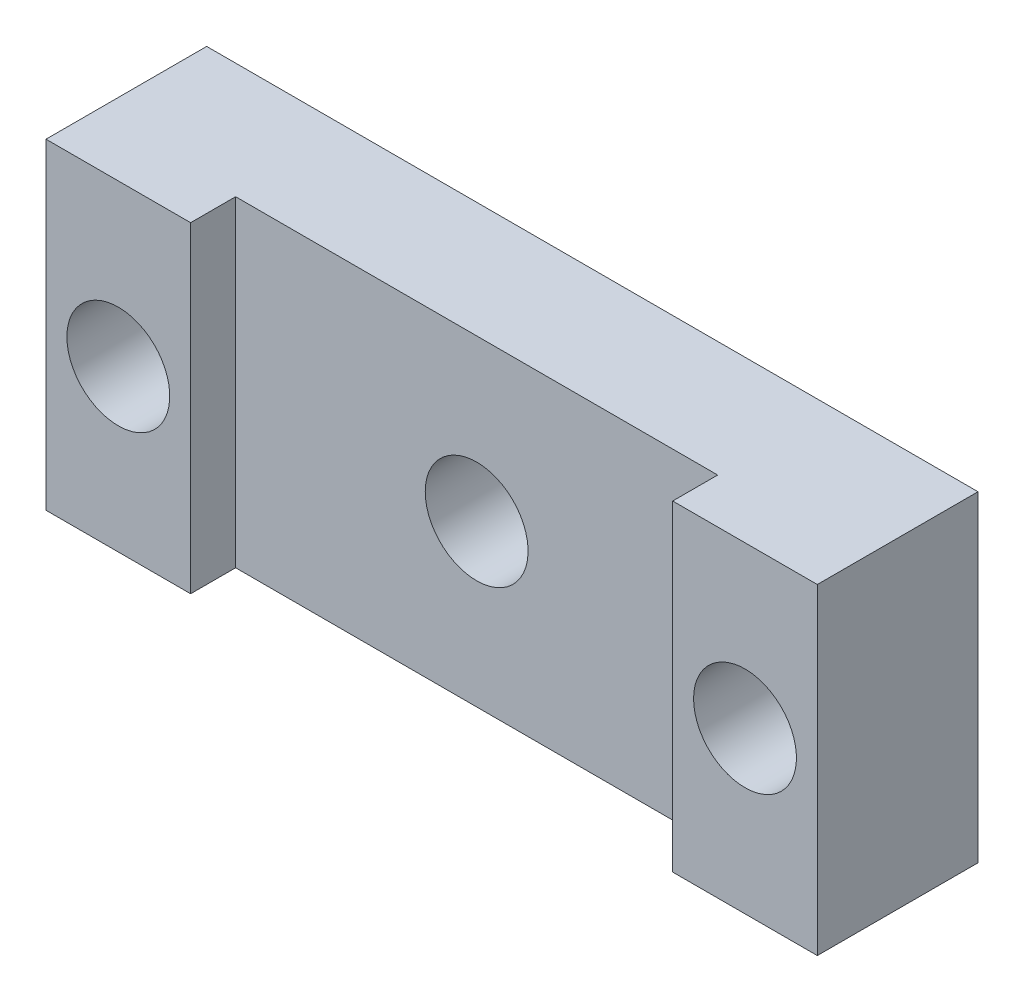
ISO-10303-21;
HEADER;
FILE_DESCRIPTION(('STEP AP214'),'2;1');
FILE_NAME('part.step','',(''),(''),'','','');
FILE_SCHEMA(('AUTOMOTIVE_DESIGN { 1 0 10303 214 1 1 1 1 }'));
ENDSEC;
DATA;
#1=APPLICATION_CONTEXT('core data for automotive mechanical design processes');
#2=APPLICATION_PROTOCOL_DEFINITION('international standard','automotive_design',2000,#1);
#3=PRODUCT_CONTEXT('',#1,'mechanical');
#4=PRODUCT('Part','Part','',(#3));
#5=PRODUCT_RELATED_PRODUCT_CATEGORY('part','',(#4));
#6=PRODUCT_DEFINITION_FORMATION('','',#4);
#7=PRODUCT_DEFINITION_CONTEXT('part definition',#1,'design');
#8=PRODUCT_DEFINITION('design','',#6,#7);
#9=PRODUCT_DEFINITION_SHAPE('','',#8);
#10=(LENGTH_UNIT() NAMED_UNIT(*) SI_UNIT(.MILLI.,.METRE.));
#11=(NAMED_UNIT(*) PLANE_ANGLE_UNIT() SI_UNIT($,.RADIAN.));
#12=(NAMED_UNIT(*) SI_UNIT($,.STERADIAN.) SOLID_ANGLE_UNIT());
#13=UNCERTAINTY_MEASURE_WITH_UNIT(LENGTH_MEASURE(1.E-05),#10,'distance_accuracy_value','');
#14=(GEOMETRIC_REPRESENTATION_CONTEXT(3) GLOBAL_UNCERTAINTY_ASSIGNED_CONTEXT((#13)) GLOBAL_UNIT_ASSIGNED_CONTEXT((#10,
#11,#12)) REPRESENTATION_CONTEXT('',''));
#15=CARTESIAN_POINT('',(0.,0.,0.));
#16=DIRECTION('',(0.,0.,1.));
#17=DIRECTION('',(1.,0.,0.));
#18=AXIS2_PLACEMENT_3D('',#15,#16,#17);
#19=CARTESIAN_POINT('',(0.,5.,0.));
#20=DIRECTION('',(1.,0.,0.));
#21=DIRECTION('',(0.,0.,-1.));
#22=AXIS2_PLACEMENT_3D('',#19,#20,#21);
#23=PLANE('',#22);
#24=DIRECTION('',(0.,0.,1.));
#25=VECTOR('',#24,1.);
#26=CARTESIAN_POINT('',(0.,0.,0.));
#27=LINE('',#26,#25);
#28=CARTESIAN_POINT('',(0.,0.,-2.5));
#29=VERTEX_POINT('',#28);
#30=CARTESIAN_POINT('',(0.,0.,0.));
#31=VERTEX_POINT('',#30);
#32=EDGE_CURVE('E128',#29,#31,#27,.T.);
#33=ORIENTED_EDGE('',*,*,#32,.T.);
#34=DIRECTION('',(0.,-1.,0.));
#35=VECTOR('',#34,1.);
#36=CARTESIAN_POINT('',(0.,5.,0.));
#37=LINE('',#36,#35);
#38=CARTESIAN_POINT('',(0.,5.,0.));
#39=VERTEX_POINT('',#38);
#40=EDGE_CURVE('E11',#39,#31,#37,.T.);
#41=ORIENTED_EDGE('',*,*,#40,.F.);
#42=DIRECTION('',(0.,0.,1.));
#43=VECTOR('',#42,1.);
#44=CARTESIAN_POINT('',(0.,5.,0.));
#45=LINE('',#44,#43);
#46=CARTESIAN_POINT('',(0.,5.,-2.5));
#47=VERTEX_POINT('',#46);
#48=EDGE_CURVE('E143',#47,#39,#45,.T.);
#49=ORIENTED_EDGE('',*,*,#48,.F.);
#50=DIRECTION('',(0.,-1.,0.));
#51=VECTOR('',#50,1.);
#52=CARTESIAN_POINT('',(0.,5.,-2.5));
#53=LINE('',#52,#51);
#54=EDGE_CURVE('E124',#47,#29,#53,.T.);
#55=ORIENTED_EDGE('',*,*,#54,.T.);
#56=EDGE_LOOP('',(#33,#41,#49,#55));
#57=FACE_BOUND('',#56,.T.);
#58=ADVANCED_FACE('F32',(#57),#23,.F.);
#59=CARTESIAN_POINT('',(0.,5.,0.));
#60=DIRECTION('',(0.,0.,-1.));
#61=DIRECTION('',(-1.,0.,0.));
#62=AXIS2_PLACEMENT_3D('',#59,#60,#61);
#63=PLANE('',#62);
#64=CARTESIAN_POINT('',(1.125,2.5,0.));
#65=DIRECTION('',(0.,0.,-1.));
#66=DIRECTION('',(-1.,0.,0.));
#67=AXIS2_PLACEMENT_3D('',#64,#65,#66);
#68=CIRCLE('',#67,0.800000050999994);
#69=CARTESIAN_POINT('',(0.324999949000006,2.5,0.));
#70=VERTEX_POINT('',#69);
#71=EDGE_CURVE('E187',#70,#70,#68,.T.);
#72=ORIENTED_EDGE('',*,*,#71,.T.);
#73=EDGE_LOOP('',(#72));
#74=FACE_BOUND('',#73,.T.);
#75=DIRECTION('',(1.,0.,0.));
#76=VECTOR('',#75,1.);
#77=CARTESIAN_POINT('',(0.,0.,0.));
#78=LINE('',#77,#76);
#79=CARTESIAN_POINT('',(2.25,0.,0.));
#80=VERTEX_POINT('',#79);
#81=EDGE_CURVE('E131',#31,#80,#78,.T.);
#82=ORIENTED_EDGE('',*,*,#81,.T.);
#83=DIRECTION('',(0.,-1.,0.));
#84=VECTOR('',#83,1.);
#85=CARTESIAN_POINT('',(2.25,5.,0.));
#86=LINE('',#85,#84);
#87=CARTESIAN_POINT('',(2.25,5.,0.));
#88=VERTEX_POINT('',#87);
#89=EDGE_CURVE('E40',#88,#80,#86,.T.);
#90=ORIENTED_EDGE('',*,*,#89,.F.);
#91=DIRECTION('',(1.,0.,0.));
#92=VECTOR('',#91,1.);
#93=CARTESIAN_POINT('',(0.,5.,0.));
#94=LINE('',#93,#92);
#95=EDGE_CURVE('E91',#39,#88,#94,.T.);
#96=ORIENTED_EDGE('',*,*,#95,.F.);
#97=ORIENTED_EDGE('',*,*,#40,.T.);
#98=EDGE_LOOP('',(#82,#90,#96,#97));
#99=FACE_BOUND('',#98,.T.);
#100=ADVANCED_FACE('F223',(#74,#99),#63,.F.);
#101=CARTESIAN_POINT('',(2.25,5.,0.));
#102=DIRECTION('',(-1.,0.,0.));
#103=DIRECTION('',(0.,0.,1.));
#104=AXIS2_PLACEMENT_3D('',#101,#102,#103);
#105=PLANE('',#104);
#106=DIRECTION('',(0.,0.,-1.));
#107=VECTOR('',#106,1.);
#108=CARTESIAN_POINT('',(2.25,0.,0.));
#109=LINE('',#108,#107);
#110=CARTESIAN_POINT('',(2.25,0.,-0.7));
#111=VERTEX_POINT('',#110);
#112=EDGE_CURVE('E134',#80,#111,#109,.T.);
#113=ORIENTED_EDGE('',*,*,#112,.T.);
#114=DIRECTION('',(0.,-1.,0.));
#115=VECTOR('',#114,1.);
#116=CARTESIAN_POINT('',(2.25,5.,-0.7));
#117=LINE('',#116,#115);
#118=CARTESIAN_POINT('',(2.25,5.,-0.7));
#119=VERTEX_POINT('',#118);
#120=EDGE_CURVE('E150',#119,#111,#117,.T.);
#121=ORIENTED_EDGE('',*,*,#120,.F.);
#122=DIRECTION('',(0.,0.,-1.));
#123=VECTOR('',#122,1.);
#124=CARTESIAN_POINT('',(2.25,5.,0.));
#125=LINE('',#124,#123);
#126=EDGE_CURVE('E158',#88,#119,#125,.T.);
#127=ORIENTED_EDGE('',*,*,#126,.F.);
#128=ORIENTED_EDGE('',*,*,#89,.T.);
#129=EDGE_LOOP('',(#113,#121,#127,#128));
#130=FACE_BOUND('',#129,.T.);
#131=ADVANCED_FACE('F156',(#130),#105,.F.);
#132=CARTESIAN_POINT('',(2.25,5.,-0.7));
#133=DIRECTION('',(0.,0.,-1.));
#134=DIRECTION('',(-1.,0.,0.));
#135=AXIS2_PLACEMENT_3D('',#132,#133,#134);
#136=PLANE('',#135);
#137=CARTESIAN_POINT('',(6.,2.5,-0.7));
#138=DIRECTION('',(0.,0.,-1.));
#139=DIRECTION('',(-1.,0.,0.));
#140=AXIS2_PLACEMENT_3D('',#137,#138,#139);
#141=CIRCLE('',#140,0.799999999999989);
#142=CARTESIAN_POINT('',(5.20000000000001,2.5,-0.7));
#143=VERTEX_POINT('',#142);
#144=EDGE_CURVE('E181',#143,#143,#141,.T.);
#145=ORIENTED_EDGE('',*,*,#144,.T.);
#146=EDGE_LOOP('',(#145));
#147=FACE_BOUND('',#146,.T.);
#148=DIRECTION('',(1.,0.,0.));
#149=VECTOR('',#148,1.);
#150=CARTESIAN_POINT('',(2.25,0.,-0.7));
#151=LINE('',#150,#149);
#152=CARTESIAN_POINT('',(9.75,0.,-0.7));
#153=VERTEX_POINT('',#152);
#154=EDGE_CURVE('E136',#111,#153,#151,.T.);
#155=ORIENTED_EDGE('',*,*,#154,.T.);
#156=DIRECTION('',(0.,-1.,0.));
#157=VECTOR('',#156,1.);
#158=CARTESIAN_POINT('',(9.75,5.,-0.7));
#159=LINE('',#158,#157);
#160=CARTESIAN_POINT('',(9.75,5.,-0.7));
#161=VERTEX_POINT('',#160);
#162=EDGE_CURVE('E147',#161,#153,#159,.T.);
#163=ORIENTED_EDGE('',*,*,#162,.F.);
#164=DIRECTION('',(1.,0.,0.));
#165=VECTOR('',#164,1.);
#166=CARTESIAN_POINT('',(2.25,5.,-0.7));
#167=LINE('',#166,#165);
#168=EDGE_CURVE('E170',#119,#161,#167,.T.);
#169=ORIENTED_EDGE('',*,*,#168,.F.);
#170=ORIENTED_EDGE('',*,*,#120,.T.);
#171=EDGE_LOOP('',(#155,#163,#169,#170));
#172=FACE_BOUND('',#171,.T.);
#173=ADVANCED_FACE('F166',(#147,#172),#136,.F.);
#174=CARTESIAN_POINT('',(9.75,5.,-0.7));
#175=DIRECTION('',(1.,0.,0.));
#176=DIRECTION('',(0.,0.,-1.));
#177=AXIS2_PLACEMENT_3D('',#174,#175,#176);
#178=PLANE('',#177);
#179=DIRECTION('',(0.,0.,1.));
#180=VECTOR('',#179,1.);
#181=CARTESIAN_POINT('',(9.75,0.,-0.7));
#182=LINE('',#181,#180);
#183=CARTESIAN_POINT('',(9.75,0.,0.));
#184=VERTEX_POINT('',#183);
#185=EDGE_CURVE('E138',#153,#184,#182,.T.);
#186=ORIENTED_EDGE('',*,*,#185,.T.);
#187=DIRECTION('',(0.,-1.,0.));
#188=VECTOR('',#187,1.);
#189=CARTESIAN_POINT('',(9.75,5.,0.));
#190=LINE('',#189,#188);
#191=CARTESIAN_POINT('',(9.75,5.,0.));
#192=VERTEX_POINT('',#191);
#193=EDGE_CURVE('E119',#192,#184,#190,.T.);
#194=ORIENTED_EDGE('',*,*,#193,.F.);
#195=DIRECTION('',(0.,0.,1.));
#196=VECTOR('',#195,1.);
#197=CARTESIAN_POINT('',(9.75,5.,-0.7));
#198=LINE('',#197,#196);
#199=EDGE_CURVE('E110',#161,#192,#198,.T.);
#200=ORIENTED_EDGE('',*,*,#199,.F.);
#201=ORIENTED_EDGE('',*,*,#162,.T.);
#202=EDGE_LOOP('',(#186,#194,#200,#201));
#203=FACE_BOUND('',#202,.T.);
#204=ADVANCED_FACE('F169',(#203),#178,.F.);
#205=CARTESIAN_POINT('',(9.75,5.,0.));
#206=DIRECTION('',(0.,0.,-1.));
#207=DIRECTION('',(-1.,0.,0.));
#208=AXIS2_PLACEMENT_3D('',#205,#206,#207);
#209=PLANE('',#208);
#210=CARTESIAN_POINT('',(10.875,2.5,0.));
#211=DIRECTION('',(0.,0.,-1.));
#212=DIRECTION('',(-1.,0.,0.));
#213=AXIS2_PLACEMENT_3D('',#210,#211,#212);
#214=CIRCLE('',#213,0.800000050999994);
#215=CARTESIAN_POINT('',(10.074999949,2.5,0.));
#216=VERTEX_POINT('',#215);
#217=EDGE_CURVE('E132',#216,#216,#214,.T.);
#218=ORIENTED_EDGE('',*,*,#217,.T.);
#219=EDGE_LOOP('',(#218));
#220=FACE_BOUND('',#219,.T.);
#221=DIRECTION('',(1.,0.,0.));
#222=VECTOR('',#221,1.);
#223=CARTESIAN_POINT('',(9.75,0.,0.));
#224=LINE('',#223,#222);
#225=CARTESIAN_POINT('',(12.,0.,0.));
#226=VERTEX_POINT('',#225);
#227=EDGE_CURVE('E118',#184,#226,#224,.T.);
#228=ORIENTED_EDGE('',*,*,#227,.T.);
#229=DIRECTION('',(0.,-1.,0.));
#230=VECTOR('',#229,1.);
#231=CARTESIAN_POINT('',(12.,5.,0.));
#232=LINE('',#231,#230);
#233=CARTESIAN_POINT('',(12.,5.,0.));
#234=VERTEX_POINT('',#233);
#235=EDGE_CURVE('E115',#234,#226,#232,.T.);
#236=ORIENTED_EDGE('',*,*,#235,.F.);
#237=DIRECTION('',(1.,0.,0.));
#238=VECTOR('',#237,1.);
#239=CARTESIAN_POINT('',(9.75,5.,0.));
#240=LINE('',#239,#238);
#241=EDGE_CURVE('E104',#192,#234,#240,.T.);
#242=ORIENTED_EDGE('',*,*,#241,.F.);
#243=ORIENTED_EDGE('',*,*,#193,.T.);
#244=EDGE_LOOP('',(#228,#236,#242,#243));
#245=FACE_BOUND('',#244,.T.);
#246=ADVANCED_FACE('F116',(#220,#245),#209,.F.);
#247=CARTESIAN_POINT('',(12.,5.,0.));
#248=DIRECTION('',(-1.,0.,0.));
#249=DIRECTION('',(0.,0.,1.));
#250=AXIS2_PLACEMENT_3D('',#247,#248,#249);
#251=PLANE('',#250);
#252=DIRECTION('',(0.,0.,-1.));
#253=VECTOR('',#252,1.);
#254=CARTESIAN_POINT('',(12.,0.,0.));
#255=LINE('',#254,#253);
#256=CARTESIAN_POINT('',(12.,0.,-2.5));
#257=VERTEX_POINT('',#256);
#258=EDGE_CURVE('E77',#226,#257,#255,.T.);
#259=ORIENTED_EDGE('',*,*,#258,.T.);
#260=DIRECTION('',(0.,-1.,0.));
#261=VECTOR('',#260,1.);
#262=CARTESIAN_POINT('',(12.,5.,-2.5));
#263=LINE('',#262,#261);
#264=CARTESIAN_POINT('',(12.,5.,-2.5));
#265=VERTEX_POINT('',#264);
#266=EDGE_CURVE('E120',#265,#257,#263,.T.);
#267=ORIENTED_EDGE('',*,*,#266,.F.);
#268=DIRECTION('',(0.,0.,-1.));
#269=VECTOR('',#268,1.);
#270=CARTESIAN_POINT('',(12.,5.,0.));
#271=LINE('',#270,#269);
#272=EDGE_CURVE('E108',#234,#265,#271,.T.);
#273=ORIENTED_EDGE('',*,*,#272,.F.);
#274=ORIENTED_EDGE('',*,*,#235,.T.);
#275=EDGE_LOOP('',(#259,#267,#273,#274));
#276=FACE_BOUND('',#275,.T.);
#277=ADVANCED_FACE('F122',(#276),#251,.F.);
#278=CARTESIAN_POINT('',(0.,5.,-2.5));
#279=DIRECTION('',(0.,0.,1.));
#280=DIRECTION('',(1.,0.,0.));
#281=AXIS2_PLACEMENT_3D('',#278,#279,#280);
#282=PLANE('',#281);
#283=CARTESIAN_POINT('',(1.125,2.5,-2.49999999999999));
#284=DIRECTION('',(0.,0.,-1.));
#285=DIRECTION('',(-1.,0.,0.));
#286=AXIS2_PLACEMENT_3D('',#283,#284,#285);
#287=CIRCLE('',#286,0.800000050999989);
#288=CARTESIAN_POINT('',(0.32499994900001,2.5,-2.49999999999999));
#289=VERTEX_POINT('',#288);
#290=EDGE_CURVE('E190',#289,#289,#287,.T.);
#291=ORIENTED_EDGE('',*,*,#290,.F.);
#292=EDGE_LOOP('',(#291));
#293=FACE_BOUND('',#292,.T.);
#294=CARTESIAN_POINT('',(6.,2.5,-2.5));
#295=DIRECTION('',(0.,0.,-1.));
#296=DIRECTION('',(-1.,0.,0.));
#297=AXIS2_PLACEMENT_3D('',#294,#295,#296);
#298=CIRCLE('',#297,0.79999999999999);
#299=CARTESIAN_POINT('',(5.20000000000001,2.5,-2.5));
#300=VERTEX_POINT('',#299);
#301=EDGE_CURVE('E184',#300,#300,#298,.T.);
#302=ORIENTED_EDGE('',*,*,#301,.F.);
#303=EDGE_LOOP('',(#302));
#304=FACE_BOUND('',#303,.T.);
#305=CARTESIAN_POINT('',(10.875,2.5,-2.5));
#306=DIRECTION('',(0.,0.,-1.));
#307=DIRECTION('',(-1.,0.,0.));
#308=AXIS2_PLACEMENT_3D('',#305,#306,#307);
#309=CIRCLE('',#308,0.800000050999989);
#310=CARTESIAN_POINT('',(10.074999949,2.5,-2.5));
#311=VERTEX_POINT('',#310);
#312=EDGE_CURVE('E178',#311,#311,#309,.T.);
#313=ORIENTED_EDGE('',*,*,#312,.F.);
#314=EDGE_LOOP('',(#313));
#315=FACE_BOUND('',#314,.T.);
#316=DIRECTION('',(-1.,0.,0.));
#317=VECTOR('',#316,1.);
#318=CARTESIAN_POINT('',(0.,0.,-2.5));
#319=LINE('',#318,#317);
#320=EDGE_CURVE('E83',#257,#29,#319,.T.);
#321=ORIENTED_EDGE('',*,*,#320,.T.);
#322=ORIENTED_EDGE('',*,*,#54,.F.);
#323=DIRECTION('',(-1.,0.,0.));
#324=VECTOR('',#323,1.);
#325=CARTESIAN_POINT('',(0.,5.,-2.5));
#326=LINE('',#325,#324);
#327=EDGE_CURVE('E48',#265,#47,#326,.T.);
#328=ORIENTED_EDGE('',*,*,#327,.F.);
#329=ORIENTED_EDGE('',*,*,#266,.T.);
#330=EDGE_LOOP('',(#321,#322,#328,#329));
#331=FACE_BOUND('',#330,.T.);
#332=ADVANCED_FACE('F197',(#293,#304,#315,#331),#282,.F.);
#333=CARTESIAN_POINT('',(0.,5.,0.));
#334=DIRECTION('',(0.,-1.,0.));
#335=DIRECTION('',(0.,0.,-1.));
#336=AXIS2_PLACEMENT_3D('',#333,#334,#335);
#337=PLANE('',#336);
#338=ORIENTED_EDGE('',*,*,#48,.T.);
#339=ORIENTED_EDGE('',*,*,#95,.T.);
#340=ORIENTED_EDGE('',*,*,#126,.T.);
#341=ORIENTED_EDGE('',*,*,#168,.T.);
#342=ORIENTED_EDGE('',*,*,#199,.T.);
#343=ORIENTED_EDGE('',*,*,#241,.T.);
#344=ORIENTED_EDGE('',*,*,#272,.T.);
#345=ORIENTED_EDGE('',*,*,#327,.T.);
#346=EDGE_LOOP('',(#338,#339,#340,#341,#342,#343,#344,#345));
#347=FACE_BOUND('',#346,.T.);
#348=ADVANCED_FACE('F106',(#347),#337,.F.);
#349=CARTESIAN_POINT('',(0.,0.,0.));
#350=DIRECTION('',(0.,-1.,0.));
#351=DIRECTION('',(0.,0.,-1.));
#352=AXIS2_PLACEMENT_3D('',#349,#350,#351);
#353=PLANE('',#352);
#354=ORIENTED_EDGE('',*,*,#32,.F.);
#355=ORIENTED_EDGE('',*,*,#320,.F.);
#356=ORIENTED_EDGE('',*,*,#258,.F.);
#357=ORIENTED_EDGE('',*,*,#227,.F.);
#358=ORIENTED_EDGE('',*,*,#185,.F.);
#359=ORIENTED_EDGE('',*,*,#154,.F.);
#360=ORIENTED_EDGE('',*,*,#112,.F.);
#361=ORIENTED_EDGE('',*,*,#81,.F.);
#362=EDGE_LOOP('',(#354,#355,#356,#357,#358,#359,#360,#361));
#363=FACE_BOUND('',#362,.T.);
#364=ADVANCED_FACE('F162',(#363),#353,.T.);
#365=CARTESIAN_POINT('',(10.875,2.5,-2.5));
#366=DIRECTION('',(0.,0.,-1.));
#367=DIRECTION('',(-1.,0.,0.));
#368=AXIS2_PLACEMENT_3D('',#365,#366,#367);
#369=CYLINDRICAL_SURFACE('',#368,0.800000050999994);
#370=ORIENTED_EDGE('',*,*,#312,.T.);
#371=EDGE_LOOP('',(#370));
#372=FACE_BOUND('',#371,.T.);
#373=ORIENTED_EDGE('',*,*,#217,.F.);
#374=EDGE_LOOP('',(#373));
#375=FACE_BOUND('',#374,.T.);
#376=ADVANCED_FACE('F205',(#372,#375),#369,.F.);
#377=CARTESIAN_POINT('',(6.,2.5,-2.5));
#378=DIRECTION('',(0.,0.,-1.));
#379=DIRECTION('',(-1.,0.,0.));
#380=AXIS2_PLACEMENT_3D('',#377,#378,#379);
#381=CYLINDRICAL_SURFACE('',#380,0.799999999999989);
#382=ORIENTED_EDGE('',*,*,#301,.T.);
#383=EDGE_LOOP('',(#382));
#384=FACE_BOUND('',#383,.T.);
#385=ORIENTED_EDGE('',*,*,#144,.F.);
#386=EDGE_LOOP('',(#385));
#387=FACE_BOUND('',#386,.T.);
#388=ADVANCED_FACE('F208',(#384,#387),#381,.F.);
#389=CARTESIAN_POINT('',(1.125,2.5,-2.49999999999999));
#390=DIRECTION('',(0.,0.,-1.));
#391=DIRECTION('',(-1.,0.,0.));
#392=AXIS2_PLACEMENT_3D('',#389,#390,#391);
#393=CYLINDRICAL_SURFACE('',#392,0.800000050999994);
#394=ORIENTED_EDGE('',*,*,#290,.T.);
#395=EDGE_LOOP('',(#394));
#396=FACE_BOUND('',#395,.T.);
#397=ORIENTED_EDGE('',*,*,#71,.F.);
#398=EDGE_LOOP('',(#397));
#399=FACE_BOUND('',#398,.T.);
#400=ADVANCED_FACE('F194',(#396,#399),#393,.F.);
#401=CLOSED_SHELL('',(#58,#100,#131,#173,#204,#246,#277,#332,#348,#364,#376,#388,#400));
#402=MANIFOLD_SOLID_BREP('B2',#401);
#403=ADVANCED_BREP_SHAPE_REPRESENTATION('',(#18,#402),#14);
#404=SHAPE_DEFINITION_REPRESENTATION(#9,#403);
ENDSEC;
END-ISO-10303-21;
